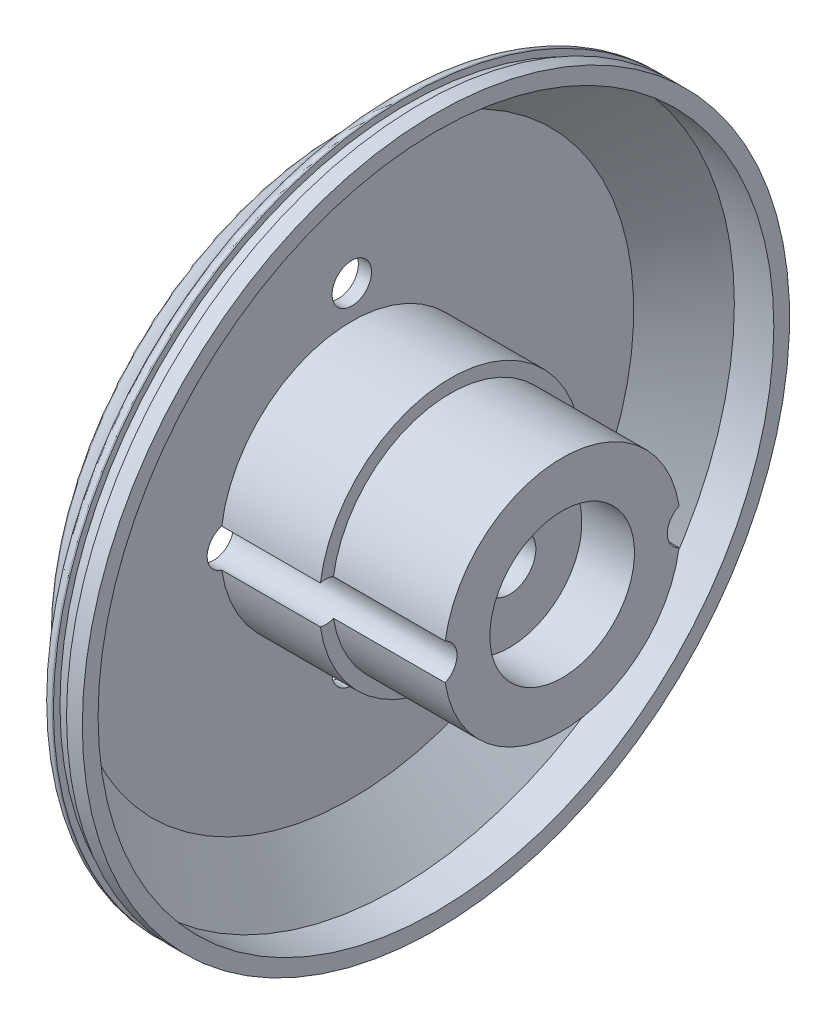
ISO-10303-21;
HEADER;
FILE_DESCRIPTION(('STEP AP214'),'2;1');
FILE_NAME('part.step','',(''),(''),'','','');
FILE_SCHEMA(('AUTOMOTIVE_DESIGN { 1 0 10303 214 1 1 1 1 }'));
ENDSEC;
DATA;
#1=APPLICATION_CONTEXT('core data for automotive mechanical design processes');
#2=APPLICATION_PROTOCOL_DEFINITION('international standard','automotive_design',2000,#1);
#3=PRODUCT_CONTEXT('',#1,'mechanical');
#4=PRODUCT('Part','Part','',(#3));
#5=PRODUCT_RELATED_PRODUCT_CATEGORY('part','',(#4));
#6=PRODUCT_DEFINITION_FORMATION('','',#4);
#7=PRODUCT_DEFINITION_CONTEXT('part definition',#1,'design');
#8=PRODUCT_DEFINITION('design','',#6,#7);
#9=PRODUCT_DEFINITION_SHAPE('','',#8);
#10=(LENGTH_UNIT() NAMED_UNIT(*) SI_UNIT(.MILLI.,.METRE.));
#11=(NAMED_UNIT(*) PLANE_ANGLE_UNIT() SI_UNIT($,.RADIAN.));
#12=(NAMED_UNIT(*) SI_UNIT($,.STERADIAN.) SOLID_ANGLE_UNIT());
#13=UNCERTAINTY_MEASURE_WITH_UNIT(LENGTH_MEASURE(1.E-05),#10,'distance_accuracy_value','');
#14=(GEOMETRIC_REPRESENTATION_CONTEXT(3) GLOBAL_UNCERTAINTY_ASSIGNED_CONTEXT((#13)) GLOBAL_UNIT_ASSIGNED_CONTEXT((#10,
#11,#12)) REPRESENTATION_CONTEXT('',''));
#15=CARTESIAN_POINT('',(0.,0.,0.));
#16=DIRECTION('',(0.,0.,1.));
#17=DIRECTION('',(1.,0.,0.));
#18=AXIS2_PLACEMENT_3D('',#15,#16,#17);
#19=CARTESIAN_POINT('',(0.,0.,0.));
#20=DIRECTION('',(-1.,0.,0.));
#21=DIRECTION('',(0.,0.,1.));
#22=AXIS2_PLACEMENT_3D('',#19,#20,#21);
#23=CYLINDRICAL_SURFACE('',#22,9.);
#24=CARTESIAN_POINT('',(8.5,0.,0.));
#25=DIRECTION('',(-1.,0.,0.));
#26=DIRECTION('',(0.,0.,1.));
#27=AXIS2_PLACEMENT_3D('',#24,#25,#26);
#28=CIRCLE('',#27,9.);
#29=CARTESIAN_POINT('',(8.5,1.37246366425319,8.89473684210526));
#30=VERTEX_POINT('',#29);
#31=CARTESIAN_POINT('',(8.5,1.37246366425319,-8.89473684210526));
#32=VERTEX_POINT('',#31);
#33=EDGE_CURVE('E126',#30,#32,#28,.T.);
#34=ORIENTED_EDGE('',*,*,#33,.F.);
#35=DIRECTION('',(-1.,0.,0.));
#36=VECTOR('',#35,1.);
#37=CARTESIAN_POINT('',(8.5,1.37246366425319,8.89473684210526));
#38=LINE('',#37,#36);
#39=CARTESIAN_POINT('',(17.,1.37246366425319,8.89473684210526));
#40=VERTEX_POINT('',#39);
#41=EDGE_CURVE('E109',#30,#40,#38,.F.);
#42=ORIENTED_EDGE('',*,*,#41,.T.);
#43=CARTESIAN_POINT('',(17.,0.,0.));
#44=DIRECTION('',(-1.,0.,0.));
#45=DIRECTION('',(0.,0.,1.));
#46=AXIS2_PLACEMENT_3D('',#43,#44,#45);
#47=CIRCLE('',#46,9.);
#48=CARTESIAN_POINT('',(17.,1.37246366425319,-8.89473684210526));
#49=VERTEX_POINT('',#48);
#50=EDGE_CURVE('E124',#40,#49,#47,.T.);
#51=ORIENTED_EDGE('',*,*,#50,.T.);
#52=DIRECTION('',(-1.,0.,0.));
#53=VECTOR('',#52,1.);
#54=CARTESIAN_POINT('',(8.5,1.37246366425319,-8.89473684210526));
#55=LINE('',#54,#53);
#56=EDGE_CURVE('E215',#49,#32,#55,.T.);
#57=ORIENTED_EDGE('',*,*,#56,.T.);
#58=EDGE_LOOP('',(#34,#42,#51,#57));
#59=FACE_BOUND('',#58,.T.);
#60=ADVANCED_FACE('F41',(#59),#23,.T.);
#61=CARTESIAN_POINT('',(8.5,0.,0.));
#62=DIRECTION('',(-1.,0.,0.));
#63=DIRECTION('',(0.,0.,1.));
#64=AXIS2_PLACEMENT_3D('',#61,#62,#63);
#65=PLANE('',#64);
#66=CARTESIAN_POINT('',(8.5,0.,0.));
#67=DIRECTION('',(-1.,0.,0.));
#68=DIRECTION('',(0.,0.,1.));
#69=AXIS2_PLACEMENT_3D('',#66,#67,#68);
#70=CIRCLE('',#69,10.);
#71=CARTESIAN_POINT('',(8.5,1.44712916682816,9.89473684210526));
#72=VERTEX_POINT('',#71);
#73=CARTESIAN_POINT('',(8.5,1.44712916682816,-9.89473684210526));
#74=VERTEX_POINT('',#73);
#75=EDGE_CURVE('E258',#72,#74,#70,.T.);
#76=ORIENTED_EDGE('',*,*,#75,.F.);
#77=CARTESIAN_POINT('',(8.5,0.,9.5));
#78=DIRECTION('',(-1.,0.,0.));
#79=DIRECTION('',(0.,0.,1.));
#80=AXIS2_PLACEMENT_3D('',#77,#78,#79);
#81=CIRCLE('',#80,1.5);
#82=EDGE_CURVE('E293',#72,#30,#81,.T.);
#83=ORIENTED_EDGE('',*,*,#82,.T.);
#84=ORIENTED_EDGE('',*,*,#33,.T.);
#85=CARTESIAN_POINT('',(8.5,0.,-9.5));
#86=DIRECTION('',(-1.,0.,0.));
#87=DIRECTION('',(0.,0.,1.));
#88=AXIS2_PLACEMENT_3D('',#85,#86,#87);
#89=CIRCLE('',#88,1.5);
#90=EDGE_CURVE('E214',#32,#74,#89,.T.);
#91=ORIENTED_EDGE('',*,*,#90,.T.);
#92=EDGE_LOOP('',(#76,#83,#84,#91));
#93=FACE_BOUND('',#92,.T.);
#94=ADVANCED_FACE('F276',(#93),#65,.F.);
#95=CARTESIAN_POINT('',(0.,0.,0.));
#96=DIRECTION('',(-1.,0.,0.));
#97=DIRECTION('',(0.,0.,1.));
#98=AXIS2_PLACEMENT_3D('',#95,#96,#97);
#99=CYLINDRICAL_SURFACE('',#98,10.);
#100=DIRECTION('',(-1.,0.,0.));
#101=VECTOR('',#100,1.);
#102=CARTESIAN_POINT('',(8.5,1.44712916682816,9.89473684210526));
#103=LINE('',#102,#101);
#104=CARTESIAN_POINT('',(1.,1.44712916682816,9.89473684210526));
#105=VERTEX_POINT('',#104);
#106=EDGE_CURVE('E57',#72,#105,#103,.T.);
#107=ORIENTED_EDGE('',*,*,#106,.F.);
#108=ORIENTED_EDGE('',*,*,#75,.T.);
#109=DIRECTION('',(-1.,0.,0.));
#110=VECTOR('',#109,1.);
#111=CARTESIAN_POINT('',(8.5,1.44712916682816,-9.89473684210526));
#112=LINE('',#111,#110);
#113=CARTESIAN_POINT('',(1.,1.44712916682816,-9.89473684210526));
#114=VERTEX_POINT('',#113);
#115=EDGE_CURVE('E203',#114,#74,#112,.F.);
#116=ORIENTED_EDGE('',*,*,#115,.F.);
#117=CARTESIAN_POINT('',(1.,0.,0.));
#118=DIRECTION('',(-1.,0.,0.));
#119=DIRECTION('',(0.,0.,1.));
#120=AXIS2_PLACEMENT_3D('',#117,#118,#119);
#121=CIRCLE('',#120,10.);
#122=EDGE_CURVE('E254',#105,#114,#121,.T.);
#123=ORIENTED_EDGE('',*,*,#122,.F.);
#124=EDGE_LOOP('',(#107,#108,#116,#123));
#125=FACE_BOUND('',#124,.T.);
#126=ADVANCED_FACE('F270',(#125),#99,.T.);
#127=CARTESIAN_POINT('',(-6.18335473428844,0.,0.));
#128=DIRECTION('',(-1.,0.,0.));
#129=DIRECTION('',(0.,0.,1.));
#130=AXIS2_PLACEMENT_3D('',#127,#128,#129);
#131=TOROIDAL_SURFACE('',#130,32.194917613122,11.9235154593095);
#132=CARTESIAN_POINT('',(4.23006744782495,0.,0.));
#133=DIRECTION('',(-1.,0.,0.));
#134=DIRECTION('',(0.,0.,1.));
#135=AXIS2_PLACEMENT_3D('',#132,#133,#134);
#136=CIRCLE('',#135,26.3870901909733);
#137=CARTESIAN_POINT('',(4.23006744782495,0.,26.3870901909733));
#138=VERTEX_POINT('',#137);
#139=EDGE_CURVE('E172',#138,#138,#136,.T.);
#140=ORIENTED_EDGE('',*,*,#139,.T.);
#141=EDGE_LOOP('',(#140));
#142=FACE_BOUND('',#141,.T.);
#143=CARTESIAN_POINT('',(0.444164031303581,0.,0.));
#144=DIRECTION('',(-1.,0.,0.));
#145=DIRECTION('',(0.,0.,1.));
#146=AXIS2_PLACEMENT_3D('',#143,#144,#145);
#147=CIRCLE('',#146,22.2829946957402);
#148=CARTESIAN_POINT('',(0.444164031303581,0.,22.2829946957402));
#149=VERTEX_POINT('',#148);
#150=EDGE_CURVE('E168',#149,#149,#147,.F.);
#151=ORIENTED_EDGE('',*,*,#150,.T.);
#152=EDGE_LOOP('',(#151));
#153=FACE_BOUND('',#152,.T.);
#154=ADVANCED_FACE('F339',(#142,#153),#131,.F.);
#155=CARTESIAN_POINT('',(0.,0.,0.));
#156=DIRECTION('',(-1.,0.,0.));
#157=DIRECTION('',(0.,0.,1.));
#158=AXIS2_PLACEMENT_3D('',#155,#156,#157);
#159=PLANE('',#158);
#160=CARTESIAN_POINT('',(0.,-12.5,0.));
#161=DIRECTION('',(-1.,0.,0.));
#162=DIRECTION('',(0.,-1.,0.));
#163=AXIS2_PLACEMENT_3D('',#160,#161,#162);
#164=CIRCLE('',#163,1.5);
#165=CARTESIAN_POINT('',(0.,-14.,0.));
#166=VERTEX_POINT('',#165);
#167=EDGE_CURVE('E422',#166,#166,#164,.T.);
#168=ORIENTED_EDGE('',*,*,#167,.F.);
#169=EDGE_LOOP('',(#168));
#170=FACE_BOUND('',#169,.T.);
#171=CARTESIAN_POINT('',(0.,0.,9.5));
#172=DIRECTION('',(-1.,0.,0.));
#173=DIRECTION('',(0.,-1.,0.));
#174=AXIS2_PLACEMENT_3D('',#171,#172,#173);
#175=CIRCLE('',#174,1.5);
#176=CARTESIAN_POINT('',(0.,-1.5,9.5));
#177=VERTEX_POINT('',#176);
#178=EDGE_CURVE('E119',#177,#177,#175,.T.);
#179=ORIENTED_EDGE('',*,*,#178,.F.);
#180=EDGE_LOOP('',(#179));
#181=FACE_BOUND('',#180,.T.);
#182=CARTESIAN_POINT('',(0.,12.5,0.));
#183=DIRECTION('',(-1.,0.,0.));
#184=DIRECTION('',(0.,-1.,0.));
#185=AXIS2_PLACEMENT_3D('',#182,#183,#184);
#186=CIRCLE('',#185,1.5);
#187=CARTESIAN_POINT('',(0.,11.,0.));
#188=VERTEX_POINT('',#187);
#189=EDGE_CURVE('E128',#188,#188,#186,.T.);
#190=ORIENTED_EDGE('',*,*,#189,.F.);
#191=EDGE_LOOP('',(#190));
#192=FACE_BOUND('',#191,.T.);
#193=CARTESIAN_POINT('',(0.,0.,-9.5));
#194=DIRECTION('',(-1.,0.,0.));
#195=DIRECTION('',(0.,-1.,0.));
#196=AXIS2_PLACEMENT_3D('',#193,#194,#195);
#197=CIRCLE('',#196,1.5);
#198=CARTESIAN_POINT('',(0.,-1.5,-9.5));
#199=VERTEX_POINT('',#198);
#200=EDGE_CURVE('E189',#199,#199,#197,.T.);
#201=ORIENTED_EDGE('',*,*,#200,.F.);
#202=EDGE_LOOP('',(#201));
#203=FACE_BOUND('',#202,.T.);
#204=CARTESIAN_POINT('',(0.,0.,0.));
#205=DIRECTION('',(-1.,0.,0.));
#206=DIRECTION('',(0.,0.,1.));
#207=AXIS2_PLACEMENT_3D('',#204,#205,#206);
#208=CIRCLE('',#207,21.4517027037763);
#209=CARTESIAN_POINT('',(0.,0.,21.4517027037763));
#210=VERTEX_POINT('',#209);
#211=EDGE_CURVE('E180',#210,#210,#208,.T.);
#212=ORIENTED_EDGE('',*,*,#211,.T.);
#213=EDGE_LOOP('',(#212));
#214=FACE_BOUND('',#213,.T.);
#215=CARTESIAN_POINT('',(0.,0.,0.));
#216=DIRECTION('',(-1.,0.,0.));
#217=DIRECTION('',(0.,0.,1.));
#218=AXIS2_PLACEMENT_3D('',#215,#216,#217);
#219=CIRCLE('',#218,5.5);
#220=CARTESIAN_POINT('',(0.,0.,5.5));
#221=VERTEX_POINT('',#220);
#222=EDGE_CURVE('E164',#221,#221,#219,.T.);
#223=ORIENTED_EDGE('',*,*,#222,.F.);
#224=EDGE_LOOP('',(#223));
#225=FACE_BOUND('',#224,.T.);
#226=ADVANCED_FACE('F335',(#170,#181,#192,#203,#214,#225),#159,.T.);
#227=CARTESIAN_POINT('',(0.,0.,0.));
#228=DIRECTION('',(-1.,0.,0.));
#229=DIRECTION('',(0.,0.,1.));
#230=AXIS2_PLACEMENT_3D('',#227,#228,#229);
#231=CYLINDRICAL_SURFACE('',#230,5.5);
#232=ORIENTED_EDGE('',*,*,#222,.T.);
#233=EDGE_LOOP('',(#232));
#234=FACE_BOUND('',#233,.T.);
#235=CARTESIAN_POINT('',(4.,0.,0.));
#236=DIRECTION('',(-1.,0.,0.));
#237=DIRECTION('',(0.,0.,1.));
#238=AXIS2_PLACEMENT_3D('',#235,#236,#237);
#239=CIRCLE('',#238,5.5);
#240=CARTESIAN_POINT('',(4.,0.,5.5));
#241=VERTEX_POINT('',#240);
#242=EDGE_CURVE('E160',#241,#241,#239,.T.);
#243=ORIENTED_EDGE('',*,*,#242,.F.);
#244=EDGE_LOOP('',(#243));
#245=FACE_BOUND('',#244,.T.);
#246=ADVANCED_FACE('F331',(#234,#245),#231,.F.);
#247=CARTESIAN_POINT('',(4.,0.,0.));
#248=DIRECTION('',(-1.,0.,0.));
#249=DIRECTION('',(0.,0.,1.));
#250=AXIS2_PLACEMENT_3D('',#247,#248,#249);
#251=PLANE('',#250);
#252=ORIENTED_EDGE('',*,*,#242,.T.);
#253=EDGE_LOOP('',(#252));
#254=FACE_BOUND('',#253,.T.);
#255=CARTESIAN_POINT('',(4.,0.,0.));
#256=DIRECTION('',(-1.,0.,0.));
#257=DIRECTION('',(0.,0.,1.));
#258=AXIS2_PLACEMENT_3D('',#255,#256,#257);
#259=CIRCLE('',#258,2.);
#260=CARTESIAN_POINT('',(4.,0.,2.));
#261=VERTEX_POINT('',#260);
#262=EDGE_CURVE('E156',#261,#261,#259,.T.);
#263=ORIENTED_EDGE('',*,*,#262,.F.);
#264=EDGE_LOOP('',(#263));
#265=FACE_BOUND('',#264,.T.);
#266=ADVANCED_FACE('F327',(#254,#265),#251,.T.);
#267=CARTESIAN_POINT('',(0.,0.,0.));
#268=DIRECTION('',(-1.,0.,0.));
#269=DIRECTION('',(0.,0.,1.));
#270=AXIS2_PLACEMENT_3D('',#267,#268,#269);
#271=CYLINDRICAL_SURFACE('',#270,2.);
#272=ORIENTED_EDGE('',*,*,#262,.T.);
#273=EDGE_LOOP('',(#272));
#274=FACE_BOUND('',#273,.T.);
#275=CARTESIAN_POINT('',(13.,0.,0.));
#276=DIRECTION('',(-1.,0.,0.));
#277=DIRECTION('',(0.,0.,1.));
#278=AXIS2_PLACEMENT_3D('',#275,#276,#277);
#279=CIRCLE('',#278,2.);
#280=CARTESIAN_POINT('',(13.,0.,2.));
#281=VERTEX_POINT('',#280);
#282=EDGE_CURVE('E152',#281,#281,#279,.T.);
#283=ORIENTED_EDGE('',*,*,#282,.F.);
#284=EDGE_LOOP('',(#283));
#285=FACE_BOUND('',#284,.T.);
#286=ADVANCED_FACE('F323',(#274,#285),#271,.F.);
#287=CARTESIAN_POINT('',(13.,0.,0.));
#288=DIRECTION('',(1.,0.,0.));
#289=DIRECTION('',(0.,0.,-1.));
#290=AXIS2_PLACEMENT_3D('',#287,#288,#289);
#291=PLANE('',#290);
#292=ORIENTED_EDGE('',*,*,#282,.T.);
#293=EDGE_LOOP('',(#292));
#294=FACE_BOUND('',#293,.T.);
#295=CARTESIAN_POINT('',(13.,0.,0.));
#296=DIRECTION('',(-1.,0.,0.));
#297=DIRECTION('',(0.,0.,1.));
#298=AXIS2_PLACEMENT_3D('',#295,#296,#297);
#299=CIRCLE('',#298,5.5);
#300=CARTESIAN_POINT('',(13.,0.,5.5));
#301=VERTEX_POINT('',#300);
#302=EDGE_CURVE('E148',#301,#301,#299,.T.);
#303=ORIENTED_EDGE('',*,*,#302,.F.);
#304=EDGE_LOOP('',(#303));
#305=FACE_BOUND('',#304,.T.);
#306=ADVANCED_FACE('F319',(#294,#305),#291,.T.);
#307=CARTESIAN_POINT('',(0.,0.,0.));
#308=DIRECTION('',(-1.,0.,0.));
#309=DIRECTION('',(0.,0.,1.));
#310=AXIS2_PLACEMENT_3D('',#307,#308,#309);
#311=CYLINDRICAL_SURFACE('',#310,5.5);
#312=ORIENTED_EDGE('',*,*,#302,.T.);
#313=EDGE_LOOP('',(#312));
#314=FACE_BOUND('',#313,.T.);
#315=CARTESIAN_POINT('',(17.,0.,0.));
#316=DIRECTION('',(-1.,0.,0.));
#317=DIRECTION('',(0.,0.,1.));
#318=AXIS2_PLACEMENT_3D('',#315,#316,#317);
#319=CIRCLE('',#318,5.5);
#320=CARTESIAN_POINT('',(17.,0.,5.5));
#321=VERTEX_POINT('',#320);
#322=EDGE_CURVE('E140',#321,#321,#319,.T.);
#323=ORIENTED_EDGE('',*,*,#322,.F.);
#324=EDGE_LOOP('',(#323));
#325=FACE_BOUND('',#324,.T.);
#326=ADVANCED_FACE('F316',(#314,#325),#311,.F.);
#327=CARTESIAN_POINT('',(17.,0.,0.));
#328=DIRECTION('',(1.,0.,0.));
#329=DIRECTION('',(0.,0.,-1.));
#330=AXIS2_PLACEMENT_3D('',#327,#328,#329);
#331=PLANE('',#330);
#332=CARTESIAN_POINT('',(17.,0.,9.5));
#333=DIRECTION('',(-1.,0.,0.));
#334=DIRECTION('',(0.,-1.,0.));
#335=AXIS2_PLACEMENT_3D('',#332,#333,#334);
#336=CIRCLE('',#335,1.5);
#337=CARTESIAN_POINT('',(17.,-1.37246366425319,8.89473684210526));
#338=VERTEX_POINT('',#337);
#339=EDGE_CURVE('E106',#40,#338,#336,.T.);
#340=ORIENTED_EDGE('',*,*,#339,.T.);
#341=CARTESIAN_POINT('',(17.,-1.37246366425319,-8.89473684210526));
#342=VERTEX_POINT('',#341);
#343=EDGE_CURVE('E135',#342,#338,#47,.T.);
#344=ORIENTED_EDGE('',*,*,#343,.F.);
#345=CARTESIAN_POINT('',(17.,0.,-9.5));
#346=DIRECTION('',(-1.,0.,0.));
#347=DIRECTION('',(0.,-1.,0.));
#348=AXIS2_PLACEMENT_3D('',#345,#346,#347);
#349=CIRCLE('',#348,1.5);
#350=EDGE_CURVE('E133',#342,#49,#349,.T.);
#351=ORIENTED_EDGE('',*,*,#350,.T.);
#352=ORIENTED_EDGE('',*,*,#50,.F.);
#353=EDGE_LOOP('',(#340,#344,#351,#352));
#354=FACE_BOUND('',#353,.T.);
#355=ORIENTED_EDGE('',*,*,#322,.T.);
#356=EDGE_LOOP('',(#355));
#357=FACE_BOUND('',#356,.T.);
#358=ADVANCED_FACE('F131',(#354,#357),#331,.T.);
#359=ORIENTED_EDGE('',*,*,#343,.T.);
#360=DIRECTION('',(-1.,0.,0.));
#361=VECTOR('',#360,1.);
#362=CARTESIAN_POINT('',(8.5,-1.37246366425319,8.89473684210526));
#363=LINE('',#362,#361);
#364=CARTESIAN_POINT('',(8.5,-1.37246366425319,8.89473684210526));
#365=VERTEX_POINT('',#364);
#366=EDGE_CURVE('E112',#338,#365,#363,.T.);
#367=ORIENTED_EDGE('',*,*,#366,.T.);
#368=CARTESIAN_POINT('',(8.5,-1.37246366425319,-8.89473684210526));
#369=VERTEX_POINT('',#368);
#370=EDGE_CURVE('E136',#369,#365,#28,.T.);
#371=ORIENTED_EDGE('',*,*,#370,.F.);
#372=DIRECTION('',(-1.,0.,0.));
#373=VECTOR('',#372,1.);
#374=CARTESIAN_POINT('',(8.5,-1.37246366425319,-8.89473684210526));
#375=LINE('',#374,#373);
#376=EDGE_CURVE('E218',#369,#342,#375,.F.);
#377=ORIENTED_EDGE('',*,*,#376,.T.);
#378=EDGE_LOOP('',(#359,#367,#371,#377));
#379=FACE_BOUND('',#378,.T.);
#380=ADVANCED_FACE('F298',(#379),#23,.T.);
#381=ORIENTED_EDGE('',*,*,#370,.T.);
#382=CARTESIAN_POINT('',(8.5,-1.44712916682816,9.89473684210526));
#383=VERTEX_POINT('',#382);
#384=EDGE_CURVE('E288',#365,#383,#81,.T.);
#385=ORIENTED_EDGE('',*,*,#384,.T.);
#386=CARTESIAN_POINT('',(8.5,-1.44712916682816,-9.89473684210526));
#387=VERTEX_POINT('',#386);
#388=EDGE_CURVE('E259',#387,#383,#70,.T.);
#389=ORIENTED_EDGE('',*,*,#388,.F.);
#390=EDGE_CURVE('E210',#387,#369,#89,.T.);
#391=ORIENTED_EDGE('',*,*,#390,.T.);
#392=EDGE_LOOP('',(#381,#385,#389,#391));
#393=FACE_BOUND('',#392,.T.);
#394=ADVANCED_FACE('F300',(#393),#65,.F.);
#395=DIRECTION('',(-1.,0.,0.));
#396=VECTOR('',#395,1.);
#397=CARTESIAN_POINT('',(8.5,-1.44712916682816,9.89473684210526));
#398=LINE('',#397,#396);
#399=CARTESIAN_POINT('',(1.,-1.44712916682816,9.89473684210526));
#400=VERTEX_POINT('',#399);
#401=EDGE_CURVE('E118',#400,#383,#398,.F.);
#402=ORIENTED_EDGE('',*,*,#401,.F.);
#403=CARTESIAN_POINT('',(1.,-1.44712916682816,-9.89473684210526));
#404=VERTEX_POINT('',#403);
#405=EDGE_CURVE('E255',#404,#400,#121,.T.);
#406=ORIENTED_EDGE('',*,*,#405,.F.);
#407=DIRECTION('',(-1.,0.,0.));
#408=VECTOR('',#407,1.);
#409=CARTESIAN_POINT('',(8.5,-1.44712916682816,-9.89473684210526));
#410=LINE('',#409,#408);
#411=EDGE_CURVE('E65',#387,#404,#410,.T.);
#412=ORIENTED_EDGE('',*,*,#411,.F.);
#413=ORIENTED_EDGE('',*,*,#388,.T.);
#414=EDGE_LOOP('',(#402,#406,#412,#413));
#415=FACE_BOUND('',#414,.T.);
#416=ADVANCED_FACE('F284',(#415),#99,.T.);
#417=CARTESIAN_POINT('',(1.,0.,0.));
#418=DIRECTION('',(1.,0.,0.));
#419=DIRECTION('',(0.,0.,-1.));
#420=AXIS2_PLACEMENT_3D('',#417,#418,#419);
#421=PLANE('',#420);
#422=CARTESIAN_POINT('',(1.,-12.5,0.));
#423=DIRECTION('',(1.,0.,0.));
#424=DIRECTION('',(0.,0.,-1.));
#425=AXIS2_PLACEMENT_3D('',#422,#423,#424);
#426=CIRCLE('',#425,1.5);
#427=CARTESIAN_POINT('',(1.,-12.5,-1.5));
#428=VERTEX_POINT('',#427);
#429=EDGE_CURVE('E45',#428,#428,#426,.T.);
#430=ORIENTED_EDGE('',*,*,#429,.F.);
#431=EDGE_LOOP('',(#430));
#432=FACE_BOUND('',#431,.T.);
#433=CARTESIAN_POINT('',(1.,0.,9.5));
#434=DIRECTION('',(1.,0.,0.));
#435=DIRECTION('',(0.,0.,-1.));
#436=AXIS2_PLACEMENT_3D('',#433,#434,#435);
#437=CIRCLE('',#436,1.5);
#438=EDGE_CURVE('E11',#105,#400,#437,.T.);
#439=ORIENTED_EDGE('',*,*,#438,.F.);
#440=ORIENTED_EDGE('',*,*,#122,.T.);
#441=CARTESIAN_POINT('',(1.,0.,-9.5));
#442=DIRECTION('',(1.,0.,0.));
#443=DIRECTION('',(0.,0.,-1.));
#444=AXIS2_PLACEMENT_3D('',#441,#442,#443);
#445=CIRCLE('',#444,1.5);
#446=EDGE_CURVE('E51',#404,#114,#445,.T.);
#447=ORIENTED_EDGE('',*,*,#446,.F.);
#448=ORIENTED_EDGE('',*,*,#405,.T.);
#449=EDGE_LOOP('',(#439,#440,#447,#448));
#450=FACE_BOUND('',#449,.T.);
#451=CARTESIAN_POINT('',(1.,12.5,0.));
#452=DIRECTION('',(1.,0.,0.));
#453=DIRECTION('',(0.,0.,-1.));
#454=AXIS2_PLACEMENT_3D('',#451,#452,#453);
#455=CIRCLE('',#454,1.5);
#456=CARTESIAN_POINT('',(1.,12.5,-1.5));
#457=VERTEX_POINT('',#456);
#458=EDGE_CURVE('E186',#457,#457,#455,.T.);
#459=ORIENTED_EDGE('',*,*,#458,.F.);
#460=EDGE_LOOP('',(#459));
#461=FACE_BOUND('',#460,.T.);
#462=CARTESIAN_POINT('',(0.999999999999999,0.,0.));
#463=DIRECTION('',(-1.,0.,0.));
#464=DIRECTION('',(0.,0.,1.));
#465=AXIS2_PLACEMENT_3D('',#462,#463,#464);
#466=CIRCLE('',#465,21.4468871308271);
#467=CARTESIAN_POINT('',(0.999999999999999,0.,21.4468871308271));
#468=VERTEX_POINT('',#467);
#469=EDGE_CURVE('E250',#468,#468,#466,.T.);
#470=ORIENTED_EDGE('',*,*,#469,.F.);
#471=EDGE_LOOP('',(#470));
#472=FACE_BOUND('',#471,.T.);
#473=ADVANCED_FACE('F280',(#432,#450,#461,#472),#421,.T.);
#474=CARTESIAN_POINT('',(0.999999999999999,0.,0.));
#475=DIRECTION('',(1.,0.,0.));
#476=DIRECTION('',(0.,0.,-1.));
#477=AXIS2_PLACEMENT_3D('',#474,#475,#476);
#478=CONICAL_SURFACE('',#477,21.4468871308271,0.896412512769207);
#479=CARTESIAN_POINT('',(4.39999999999999,0.,0.));
#480=DIRECTION('',(-1.,0.,0.));
#481=DIRECTION('',(0.,0.,1.));
#482=AXIS2_PLACEMENT_3D('',#479,#480,#481);
#483=CIRCLE('',#482,25.7);
#484=CARTESIAN_POINT('',(4.39999999999999,0.,25.7));
#485=VERTEX_POINT('',#484);
#486=EDGE_CURVE('E246',#485,#485,#483,.T.);
#487=ORIENTED_EDGE('',*,*,#486,.F.);
#488=EDGE_LOOP('',(#487));
#489=FACE_BOUND('',#488,.T.);
#490=ORIENTED_EDGE('',*,*,#469,.T.);
#491=EDGE_LOOP('',(#490));
#492=FACE_BOUND('',#491,.T.);
#493=ADVANCED_FACE('F409',(#489,#492),#478,.F.);
#494=CARTESIAN_POINT('',(0.,0.,0.));
#495=DIRECTION('',(-1.,0.,0.));
#496=DIRECTION('',(0.,0.,1.));
#497=AXIS2_PLACEMENT_3D('',#494,#495,#496);
#498=CYLINDRICAL_SURFACE('',#497,25.7);
#499=CARTESIAN_POINT('',(7.39999999999999,0.,0.));
#500=DIRECTION('',(-1.,0.,0.));
#501=DIRECTION('',(0.,0.,1.));
#502=AXIS2_PLACEMENT_3D('',#499,#500,#501);
#503=CIRCLE('',#502,25.7);
#504=CARTESIAN_POINT('',(7.39999999999999,0.,25.7));
#505=VERTEX_POINT('',#504);
#506=EDGE_CURVE('E242',#505,#505,#503,.T.);
#507=ORIENTED_EDGE('',*,*,#506,.F.);
#508=EDGE_LOOP('',(#507));
#509=FACE_BOUND('',#508,.T.);
#510=ORIENTED_EDGE('',*,*,#486,.T.);
#511=EDGE_LOOP('',(#510));
#512=FACE_BOUND('',#511,.T.);
#513=ADVANCED_FACE('F403',(#509,#512),#498,.F.);
#514=CARTESIAN_POINT('',(7.39999999999999,0.,0.));
#515=DIRECTION('',(-1.,0.,0.));
#516=DIRECTION('',(0.,0.,1.));
#517=AXIS2_PLACEMENT_3D('',#514,#515,#516);
#518=PLANE('',#517);
#519=CARTESIAN_POINT('',(7.39999999999999,0.,0.));
#520=DIRECTION('',(-1.,0.,0.));
#521=DIRECTION('',(0.,0.,1.));
#522=AXIS2_PLACEMENT_3D('',#519,#520,#521);
#523=CIRCLE('',#522,26.9);
#524=CARTESIAN_POINT('',(7.39999999999999,0.,26.9));
#525=VERTEX_POINT('',#524);
#526=EDGE_CURVE('E238',#525,#525,#523,.T.);
#527=ORIENTED_EDGE('',*,*,#526,.F.);
#528=EDGE_LOOP('',(#527));
#529=FACE_BOUND('',#528,.T.);
#530=ORIENTED_EDGE('',*,*,#506,.T.);
#531=EDGE_LOOP('',(#530));
#532=FACE_BOUND('',#531,.T.);
#533=ADVANCED_FACE('F397',(#529,#532),#518,.F.);
#534=CARTESIAN_POINT('',(0.,0.,0.));
#535=DIRECTION('',(-1.,0.,0.));
#536=DIRECTION('',(0.,0.,1.));
#537=AXIS2_PLACEMENT_3D('',#534,#535,#536);
#538=CYLINDRICAL_SURFACE('',#537,26.9);
#539=ORIENTED_EDGE('',*,*,#526,.T.);
#540=EDGE_LOOP('',(#539));
#541=FACE_BOUND('',#540,.T.);
#542=CARTESIAN_POINT('',(6.19999999999999,0.,0.));
#543=DIRECTION('',(-1.,0.,0.));
#544=DIRECTION('',(0.,0.,1.));
#545=AXIS2_PLACEMENT_3D('',#542,#543,#544);
#546=CIRCLE('',#545,26.9);
#547=CARTESIAN_POINT('',(6.19999999999999,0.,26.9));
#548=VERTEX_POINT('',#547);
#549=EDGE_CURVE('E234',#548,#548,#546,.T.);
#550=ORIENTED_EDGE('',*,*,#549,.F.);
#551=EDGE_LOOP('',(#550));
#552=FACE_BOUND('',#551,.T.);
#553=ADVANCED_FACE('F392',(#541,#552),#538,.T.);
#554=CARTESIAN_POINT('',(6.19999999999999,0.,0.));
#555=DIRECTION('',(1.,0.,0.));
#556=DIRECTION('',(0.,0.,-1.));
#557=AXIS2_PLACEMENT_3D('',#554,#555,#556);
#558=PLANE('',#557);
#559=CARTESIAN_POINT('',(6.19999999999999,0.,0.));
#560=DIRECTION('',(-1.,0.,0.));
#561=DIRECTION('',(0.,0.,1.));
#562=AXIS2_PLACEMENT_3D('',#559,#560,#561);
#563=CIRCLE('',#562,26.4);
#564=CARTESIAN_POINT('',(6.19999999999999,0.,26.4));
#565=VERTEX_POINT('',#564);
#566=EDGE_CURVE('E230',#565,#565,#563,.T.);
#567=ORIENTED_EDGE('',*,*,#566,.F.);
#568=EDGE_LOOP('',(#567));
#569=FACE_BOUND('',#568,.T.);
#570=ORIENTED_EDGE('',*,*,#549,.T.);
#571=EDGE_LOOP('',(#570));
#572=FACE_BOUND('',#571,.T.);
#573=ADVANCED_FACE('F386',(#569,#572),#558,.F.);
#574=CARTESIAN_POINT('',(0.,0.,0.));
#575=DIRECTION('',(-1.,0.,0.));
#576=DIRECTION('',(0.,0.,1.));
#577=AXIS2_PLACEMENT_3D('',#574,#575,#576);
#578=CYLINDRICAL_SURFACE('',#577,26.4);
#579=CARTESIAN_POINT('',(5.19999999999999,0.,0.));
#580=DIRECTION('',(-1.,0.,0.));
#581=DIRECTION('',(0.,0.,1.));
#582=AXIS2_PLACEMENT_3D('',#579,#580,#581);
#583=CIRCLE('',#582,26.4);
#584=CARTESIAN_POINT('',(5.19999999999999,0.,26.4));
#585=VERTEX_POINT('',#584);
#586=EDGE_CURVE('E226',#585,#585,#583,.T.);
#587=ORIENTED_EDGE('',*,*,#586,.F.);
#588=EDGE_LOOP('',(#587));
#589=FACE_BOUND('',#588,.T.);
#590=ORIENTED_EDGE('',*,*,#566,.T.);
#591=EDGE_LOOP('',(#590));
#592=FACE_BOUND('',#591,.T.);
#593=ADVANCED_FACE('F380',(#589,#592),#578,.T.);
#594=CARTESIAN_POINT('',(5.19999999999999,0.,0.));
#595=DIRECTION('',(-1.,0.,0.));
#596=DIRECTION('',(0.,0.,1.));
#597=AXIS2_PLACEMENT_3D('',#594,#595,#596);
#598=PLANE('',#597);
#599=CARTESIAN_POINT('',(5.2,0.,0.));
#600=DIRECTION('',(-1.,0.,0.));
#601=DIRECTION('',(0.,0.,1.));
#602=AXIS2_PLACEMENT_3D('',#599,#600,#601);
#603=CIRCLE('',#602,26.9);
#604=CARTESIAN_POINT('',(5.2,0.,26.9));
#605=VERTEX_POINT('',#604);
#606=EDGE_CURVE('E222',#605,#605,#603,.T.);
#607=ORIENTED_EDGE('',*,*,#606,.F.);
#608=EDGE_LOOP('',(#607));
#609=FACE_BOUND('',#608,.T.);
#610=ORIENTED_EDGE('',*,*,#586,.T.);
#611=EDGE_LOOP('',(#610));
#612=FACE_BOUND('',#611,.T.);
#613=ADVANCED_FACE('F352',(#609,#612),#598,.F.);
#614=CARTESIAN_POINT('',(0.,0.,0.));
#615=DIRECTION('',(-1.,0.,0.));
#616=DIRECTION('',(0.,0.,1.));
#617=AXIS2_PLACEMENT_3D('',#614,#615,#616);
#618=CYLINDRICAL_SURFACE('',#617,26.9);
#619=CARTESIAN_POINT('',(5.10341912146937,0.,0.));
#620=DIRECTION('',(1.,0.,0.));
#621=DIRECTION('',(0.,0.,-1.));
#622=AXIS2_PLACEMENT_3D('',#619,#620,#621);
#623=CIRCLE('',#622,26.9);
#624=CARTESIAN_POINT('',(5.10341912146937,0.,-26.9));
#625=VERTEX_POINT('',#624);
#626=EDGE_CURVE('E176',#625,#625,#623,.T.);
#627=ORIENTED_EDGE('',*,*,#626,.T.);
#628=EDGE_LOOP('',(#627));
#629=FACE_BOUND('',#628,.T.);
#630=ORIENTED_EDGE('',*,*,#606,.T.);
#631=EDGE_LOOP('',(#630));
#632=FACE_BOUND('',#631,.T.);
#633=ADVANCED_FACE('F345',(#629,#632),#618,.T.);
#634=CARTESIAN_POINT('',(5.10341912146937,0.,0.));
#635=DIRECTION('',(1.,0.,0.));
#636=DIRECTION('',(0.,0.,-1.));
#637=AXIS2_PLACEMENT_3D('',#634,#635,#636);
#638=TOROIDAL_SURFACE('',#637,25.9,1.);
#639=ORIENTED_EDGE('',*,*,#626,.F.);
#640=EDGE_LOOP('',(#639));
#641=FACE_BOUND('',#640,.T.);
#642=ORIENTED_EDGE('',*,*,#139,.F.);
#643=EDGE_LOOP('',(#642));
#644=FACE_BOUND('',#643,.T.);
#645=ADVANCED_FACE('F343',(#641,#644),#638,.T.);
#646=CARTESIAN_POINT('',(1.,0.,0.));
#647=DIRECTION('',(1.,0.,0.));
#648=DIRECTION('',(0.,0.,-1.));
#649=AXIS2_PLACEMENT_3D('',#646,#647,#648);
#650=TOROIDAL_SURFACE('',#649,21.4517027037763,1.);
#651=ORIENTED_EDGE('',*,*,#150,.F.);
#652=EDGE_LOOP('',(#651));
#653=FACE_BOUND('',#652,.T.);
#654=ORIENTED_EDGE('',*,*,#211,.F.);
#655=EDGE_LOOP('',(#654));
#656=FACE_BOUND('',#655,.T.);
#657=ADVANCED_FACE('F43',(#653,#656),#650,.T.);
#658=CARTESIAN_POINT('',(17.,0.,-9.5));
#659=DIRECTION('',(-1.,0.,0.));
#660=DIRECTION('',(0.,-1.,0.));
#661=AXIS2_PLACEMENT_3D('',#658,#659,#660);
#662=CYLINDRICAL_SURFACE('',#661,1.5);
#663=ORIENTED_EDGE('',*,*,#200,.T.);
#664=EDGE_LOOP('',(#663));
#665=FACE_BOUND('',#664,.T.);
#666=ORIENTED_EDGE('',*,*,#390,.F.);
#667=ORIENTED_EDGE('',*,*,#411,.T.);
#668=ORIENTED_EDGE('',*,*,#446,.T.);
#669=ORIENTED_EDGE('',*,*,#115,.T.);
#670=ORIENTED_EDGE('',*,*,#90,.F.);
#671=ORIENTED_EDGE('',*,*,#56,.F.);
#672=ORIENTED_EDGE('',*,*,#350,.F.);
#673=ORIENTED_EDGE('',*,*,#376,.F.);
#674=EDGE_LOOP('',(#666,#667,#668,#669,#670,#671,#672,#673));
#675=FACE_BOUND('',#674,.T.);
#676=ADVANCED_FACE('F275',(#665,#675),#662,.F.);
#677=CARTESIAN_POINT('',(17.,12.5,0.));
#678=DIRECTION('',(-1.,0.,0.));
#679=DIRECTION('',(0.,-1.,0.));
#680=AXIS2_PLACEMENT_3D('',#677,#678,#679);
#681=CYLINDRICAL_SURFACE('',#680,1.5);
#682=ORIENTED_EDGE('',*,*,#458,.T.);
#683=EDGE_LOOP('',(#682));
#684=FACE_BOUND('',#683,.T.);
#685=ORIENTED_EDGE('',*,*,#189,.T.);
#686=EDGE_LOOP('',(#685));
#687=FACE_BOUND('',#686,.T.);
#688=ADVANCED_FACE('F438',(#684,#687),#681,.F.);
#689=CARTESIAN_POINT('',(17.,0.,9.5));
#690=DIRECTION('',(-1.,0.,0.));
#691=DIRECTION('',(0.,-1.,0.));
#692=AXIS2_PLACEMENT_3D('',#689,#690,#691);
#693=CYLINDRICAL_SURFACE('',#692,1.5);
#694=ORIENTED_EDGE('',*,*,#178,.T.);
#695=EDGE_LOOP('',(#694));
#696=FACE_BOUND('',#695,.T.);
#697=ORIENTED_EDGE('',*,*,#82,.F.);
#698=ORIENTED_EDGE('',*,*,#106,.T.);
#699=ORIENTED_EDGE('',*,*,#438,.T.);
#700=ORIENTED_EDGE('',*,*,#401,.T.);
#701=ORIENTED_EDGE('',*,*,#384,.F.);
#702=ORIENTED_EDGE('',*,*,#366,.F.);
#703=ORIENTED_EDGE('',*,*,#339,.F.);
#704=ORIENTED_EDGE('',*,*,#41,.F.);
#705=EDGE_LOOP('',(#697,#698,#699,#700,#701,#702,#703,#704));
#706=FACE_BOUND('',#705,.T.);
#707=ADVANCED_FACE('F108',(#696,#706),#693,.F.);
#708=CARTESIAN_POINT('',(17.,-12.5,0.));
#709=DIRECTION('',(-1.,0.,0.));
#710=DIRECTION('',(0.,-1.,0.));
#711=AXIS2_PLACEMENT_3D('',#708,#709,#710);
#712=CYLINDRICAL_SURFACE('',#711,1.5);
#713=ORIENTED_EDGE('',*,*,#429,.T.);
#714=EDGE_LOOP('',(#713));
#715=FACE_BOUND('',#714,.T.);
#716=ORIENTED_EDGE('',*,*,#167,.T.);
#717=EDGE_LOOP('',(#716));
#718=FACE_BOUND('',#717,.T.);
#719=ADVANCED_FACE('F430',(#715,#718),#712,.F.);
#720=CLOSED_SHELL('',(#60,#94,#126,#154,#226,#246,#266,#286,#306,#326,#358,#380,#394,#416,#473,
#493,#513,#533,#553,#573,#593,#613,#633,#645,#657,#676,#688,#707,#719));
#721=MANIFOLD_SOLID_BREP('B2',#720);
#722=ADVANCED_BREP_SHAPE_REPRESENTATION('',(#18,#721),#14);
#723=SHAPE_DEFINITION_REPRESENTATION(#9,#722);
ENDSEC;
END-ISO-10303-21;
